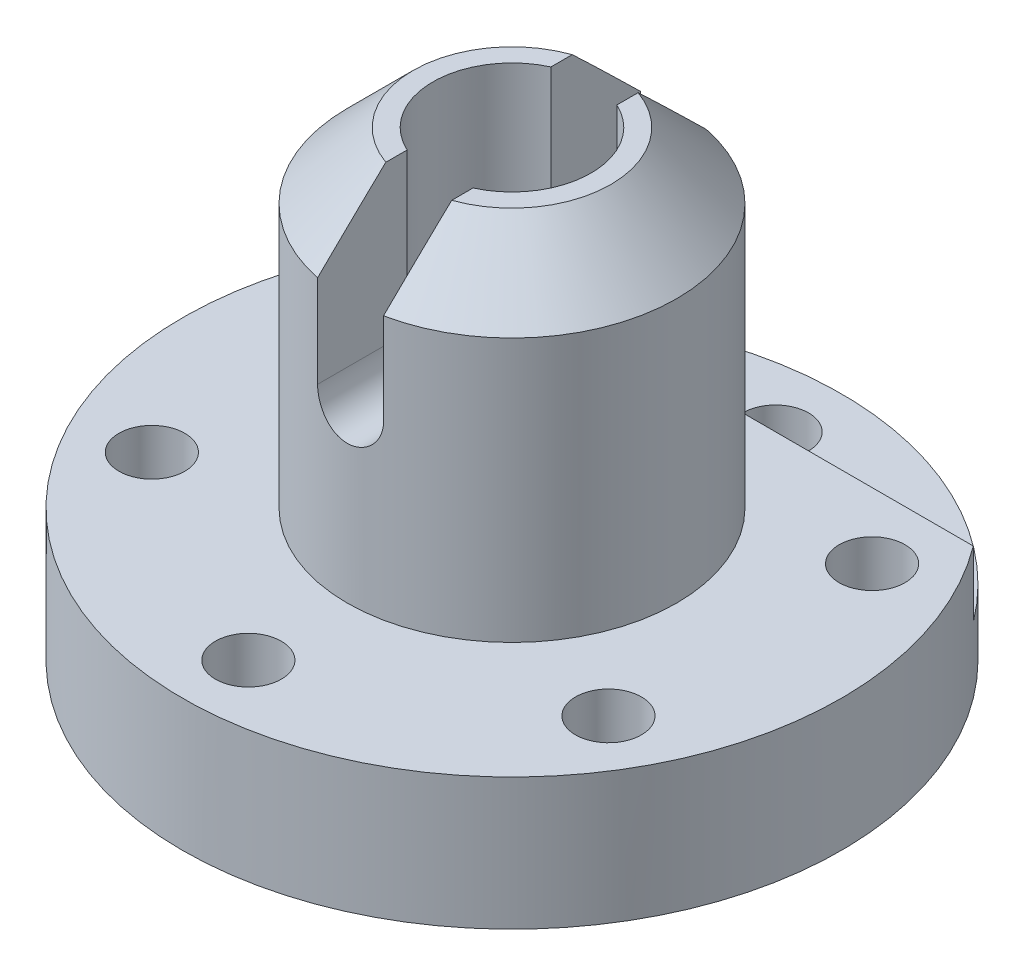
ISO-10303-21;
HEADER;
FILE_DESCRIPTION(('STEP AP214'),'2;1');
FILE_NAME('part.step','',(''),(''),'','','');
FILE_SCHEMA(('AUTOMOTIVE_DESIGN { 1 0 10303 214 1 1 1 1 }'));
ENDSEC;
DATA;
#1=APPLICATION_CONTEXT('core data for automotive mechanical design processes');
#2=APPLICATION_PROTOCOL_DEFINITION('international standard','automotive_design',2000,#1);
#3=PRODUCT_CONTEXT('',#1,'mechanical');
#4=PRODUCT('Part','Part','',(#3));
#5=PRODUCT_RELATED_PRODUCT_CATEGORY('part','',(#4));
#6=PRODUCT_DEFINITION_FORMATION('','',#4);
#7=PRODUCT_DEFINITION_CONTEXT('part definition',#1,'design');
#8=PRODUCT_DEFINITION('design','',#6,#7);
#9=PRODUCT_DEFINITION_SHAPE('','',#8);
#10=(LENGTH_UNIT() NAMED_UNIT(*) SI_UNIT(.MILLI.,.METRE.));
#11=(NAMED_UNIT(*) PLANE_ANGLE_UNIT() SI_UNIT($,.RADIAN.));
#12=(NAMED_UNIT(*) SI_UNIT($,.STERADIAN.) SOLID_ANGLE_UNIT());
#13=UNCERTAINTY_MEASURE_WITH_UNIT(LENGTH_MEASURE(1.E-05),#10,'distance_accuracy_value','');
#14=(GEOMETRIC_REPRESENTATION_CONTEXT(3) GLOBAL_UNCERTAINTY_ASSIGNED_CONTEXT((#13)) GLOBAL_UNIT_ASSIGNED_CONTEXT((#10,
#11,#12)) REPRESENTATION_CONTEXT('',''));
#15=CARTESIAN_POINT('',(0.,0.,0.));
#16=DIRECTION('',(0.,0.,1.));
#17=DIRECTION('',(1.,0.,0.));
#18=AXIS2_PLACEMENT_3D('',#15,#16,#17);
#19=CARTESIAN_POINT('',(0.,35.,0.));
#20=DIRECTION('',(0.,-1.,0.));
#21=DIRECTION('',(0.,0.,-1.));
#22=AXIS2_PLACEMENT_3D('',#19,#20,#21);
#23=CYLINDRICAL_SURFACE('',#22,6.);
#24=CARTESIAN_POINT('',(0.,10.,0.));
#25=DIRECTION('',(0.,1.,0.));
#26=DIRECTION('',(0.,0.,1.));
#27=AXIS2_PLACEMENT_3D('',#24,#25,#26);
#28=CIRCLE('',#27,6.);
#29=CARTESIAN_POINT('',(0.,10.,6.));
#30=VERTEX_POINT('',#29);
#31=EDGE_CURVE('E161',#30,#30,#28,.F.);
#32=ORIENTED_EDGE('',*,*,#31,.T.);
#33=EDGE_LOOP('',(#32));
#34=FACE_BOUND('',#33,.T.);
#35=CARTESIAN_POINT('',(0.,35.,0.));
#36=DIRECTION('',(0.,1.,0.));
#37=DIRECTION('',(0.,0.,1.));
#38=AXIS2_PLACEMENT_3D('',#35,#36,#37);
#39=CIRCLE('',#38,6.);
#40=CARTESIAN_POINT('',(-2.5,35.,-5.45435605731786));
#41=VERTEX_POINT('',#40);
#42=CARTESIAN_POINT('',(-2.5,35.,5.45435605731786));
#43=VERTEX_POINT('',#42);
#44=EDGE_CURVE('E151',#41,#43,#39,.T.);
#45=ORIENTED_EDGE('',*,*,#44,.T.);
#46=DIRECTION('',(0.,-1.,0.));
#47=VECTOR('',#46,1.);
#48=CARTESIAN_POINT('',(-2.5,35.,5.45435605731786));
#49=LINE('',#48,#47);
#50=CARTESIAN_POINT('',(-2.5,23.,5.45435605731786));
#51=VERTEX_POINT('',#50);
#52=EDGE_CURVE('E210',#43,#51,#49,.T.);
#53=ORIENTED_EDGE('',*,*,#52,.T.);
#54=CARTESIAN_POINT('',(2.5,23.,5.45435605731786));
#55=CARTESIAN_POINT('',(2.50001024965806,22.933009578603,5.4543414367274));
#56=CARTESIAN_POINT('',(2.49730766074456,22.8660271423929,5.45558986423115));
#57=CARTESIAN_POINT('',(2.48655699342007,22.732608782394,5.46050344433192));
#58=CARTESIAN_POINT('',(2.47851112553775,22.6661726441022,5.46416759753227));
#59=CARTESIAN_POINT('',(2.45719882557102,22.5345981401286,5.47378318611766));
#60=CARTESIAN_POINT('',(2.44395446621823,22.4694554951153,5.47972494833872));
#61=CARTESIAN_POINT('',(2.41239773056354,22.3406523494294,5.49369035165668));
#62=CARTESIAN_POINT('',(2.39408500729503,22.2769919505508,5.50171413528084));
#63=CARTESIAN_POINT('',(2.33184505253746,22.0890295233108,5.52852216859036));
#64=CARTESIAN_POINT('',(2.28056973965757,21.9674650590801,5.55006534458072));
#65=CARTESIAN_POINT('',(2.16009667726577,21.734605030022,5.5980502687434));
#66=CARTESIAN_POINT('',(2.09088024017803,21.6233203375838,5.62449711638194));
#67=CARTESIAN_POINT('',(1.93194216605247,21.4073444819703,5.68111739532849));
#68=CARTESIAN_POINT('',(1.84129131772597,21.3033685362415,5.71141645652258));
#69=CARTESIAN_POINT('',(1.64402473251641,21.1115830630309,5.77129106659512));
#70=CARTESIAN_POINT('',(1.53740558511416,21.0237769980765,5.80086645933831));
#71=CARTESIAN_POINT('',(1.3055266241911,20.8631011710238,5.85751079611205));
#72=CARTESIAN_POINT('',(1.17965801419142,20.7910465122975,5.88441492036276));
#73=CARTESIAN_POINT('',(0.916263349803656,20.6694476051954,5.93113050419023));
#74=CARTESIAN_POINT('',(0.778742558960749,20.6198932565872,5.95094514533806));
#75=CARTESIAN_POINT('',(0.503538212911764,20.5473214289529,5.98035028996095));
#76=CARTESIAN_POINT('',(0.366235636683351,20.5230570539867,5.99041924152298));
#77=CARTESIAN_POINT('',(0.0891608856613075,20.497724732109,6.00093656296527));
#78=CARTESIAN_POINT('',(-0.0506103107853695,20.4966477933812,6.00138866214753));
#79=CARTESIAN_POINT('',(-0.319586702683724,20.5170686483622,5.99290254661358));
#80=CARTESIAN_POINT('',(-0.448917245472144,20.5371965487351,5.98453414521297));
#81=CARTESIAN_POINT('',(-0.702167963543971,20.5971069089122,5.96013005449445));
#82=CARTESIAN_POINT('',(-0.826087834150438,20.6368904739846,5.94409393401056));
#83=CARTESIAN_POINT('',(-1.06727556823007,20.7354557836619,5.90559715444489));
#84=CARTESIAN_POINT('',(-1.1844130633202,20.7945181793044,5.88304219015531));
#85=CARTESIAN_POINT('',(-1.40742238732224,20.9296907819691,5.83371457161593));
#86=CARTESIAN_POINT('',(-1.51329009151026,21.0058071993045,5.80694038196897));
#87=CARTESIAN_POINT('',(-1.71867537807254,21.1791590335425,5.74963576527152));
#88=CARTESIAN_POINT('',(-1.81722082953265,21.2775041712583,5.71897359653013));
#89=CARTESIAN_POINT('',(-1.99685313522822,21.4894106464249,5.65876079183101));
#90=CARTESIAN_POINT('',(-2.07793113494236,21.6029796539946,5.62921072584973));
#91=CARTESIAN_POINT('',(-2.22284514508404,21.8468546501545,5.57361619012468));
#92=CARTESIAN_POINT('',(-2.28601504206341,21.9775928734739,5.54772171984214));
#93=CARTESIAN_POINT('',(-2.38897619183128,22.2491453734569,5.50417661447929));
#94=CARTESIAN_POINT('',(-2.4288105117282,22.3899405469978,5.48651080537515));
#95=CARTESIAN_POINT('',(-2.47065526537902,22.6101508434078,5.46773287951056));
#96=CARTESIAN_POINT('',(-2.48164099212926,22.6876310667866,5.46274303006064));
#97=CARTESIAN_POINT('',(-2.49631631258703,22.8433901813396,5.45604541462647));
#98=CARTESIAN_POINT('',(-2.50000851178051,22.9216687772607,5.45433647659977));
#99=CARTESIAN_POINT('',(-2.5,23.,5.45435605731786));
#100=B_SPLINE_CURVE_WITH_KNOTS('',3,(#54,#55,#56,#57,#58,#59,#60,#61,#62,#63,#64,#65,#66,#67,
#68,#69,#70,#71,#72,#73,#74,#75,#76,#77,#78,#79,#80,#81,#82,#83,#84,#85,#86,#87,#88,#89,#90,#91,
#92,#93,#94,#95,#96,#97,#98,#99),.UNSPECIFIED.,.F.,.F.,(4,2,2,2,2,2,2,2,2,2,2,2,2,2,2,2,2,2,2,2,
2,2,4),(0.,0.200891876435008,0.401700695097973,0.601665948391959,0.801644894158599,
1.20075599352942,1.6002844916061,2.02212344548655,2.44405262481498,2.88432120276328,
3.32439195134774,3.74155898035476,4.15856423395471,4.55019084443641,4.94183947919071,
5.33946474085078,5.73723503589979,6.16301556467704,6.58901142297275,7.02923147484728,
7.4686364954648,7.70350874445825,7.93829707423866),.UNSPECIFIED.);
#101=CARTESIAN_POINT('',(2.5,23.,5.45435605731786));
#102=VERTEX_POINT('',#101);
#103=EDGE_CURVE('E143',#102,#51,#100,.T.);
#104=ORIENTED_EDGE('',*,*,#103,.F.);
#105=DIRECTION('',(0.,-1.,0.));
#106=VECTOR('',#105,1.);
#107=CARTESIAN_POINT('',(2.5,35.,5.45435605731786));
#108=LINE('',#107,#106);
#109=CARTESIAN_POINT('',(2.5,35.,5.45435605731786));
#110=VERTEX_POINT('',#109);
#111=EDGE_CURVE('E129',#110,#102,#108,.T.);
#112=ORIENTED_EDGE('',*,*,#111,.F.);
#113=CARTESIAN_POINT('',(2.5,35.,-5.45435605731786));
#114=VERTEX_POINT('',#113);
#115=EDGE_CURVE('E141',#110,#114,#39,.T.);
#116=ORIENTED_EDGE('',*,*,#115,.T.);
#117=DIRECTION('',(0.,-1.,0.));
#118=VECTOR('',#117,1.);
#119=CARTESIAN_POINT('',(2.5,35.,-5.45435605731786));
#120=LINE('',#119,#118);
#121=CARTESIAN_POINT('',(2.5,23.,-5.45435605731786));
#122=VERTEX_POINT('',#121);
#123=EDGE_CURVE('E145',#122,#114,#120,.F.);
#124=ORIENTED_EDGE('',*,*,#123,.F.);
#125=CARTESIAN_POINT('',(-2.5,23.,-5.45435605731786));
#126=CARTESIAN_POINT('',(-2.50001024965805,22.933009578603,-5.4543414367274));
#127=CARTESIAN_POINT('',(-2.49730766074456,22.8660271423929,-5.45558986423115));
#128=CARTESIAN_POINT('',(-2.48655699342007,22.732608782394,-5.46050344433192));
#129=CARTESIAN_POINT('',(-2.47851112553775,22.6661726441022,-5.46416759753227));
#130=CARTESIAN_POINT('',(-2.45719882557102,22.5345981401286,-5.47378318611766));
#131=CARTESIAN_POINT('',(-2.44395446621823,22.4694554951153,-5.47972494833872));
#132=CARTESIAN_POINT('',(-2.41239773056354,22.3406523494294,-5.49369035165668));
#133=CARTESIAN_POINT('',(-2.39408500729503,22.2769919505508,-5.50171413528084));
#134=CARTESIAN_POINT('',(-2.33184505253746,22.0890295233108,-5.52852216859036));
#135=CARTESIAN_POINT('',(-2.28056973965756,21.9674650590801,-5.55006534458073));
#136=CARTESIAN_POINT('',(-2.16009667726576,21.734605030022,-5.5980502687434));
#137=CARTESIAN_POINT('',(-2.09088024017802,21.6233203375838,-5.62449711638194));
#138=CARTESIAN_POINT('',(-1.93194216605246,21.4073444819703,-5.6811173953285));
#139=CARTESIAN_POINT('',(-1.84129131772596,21.3033685362415,-5.71141645652258));
#140=CARTESIAN_POINT('',(-1.6440247325164,21.1115830630309,-5.77129106659512));
#141=CARTESIAN_POINT('',(-1.53740558511415,21.0237769980765,-5.80086645933832));
#142=CARTESIAN_POINT('',(-1.30552662419109,20.8631011710238,-5.85751079611205));
#143=CARTESIAN_POINT('',(-1.17965801419141,20.7910465122975,-5.88441492036276));
#144=CARTESIAN_POINT('',(-0.916263349803652,20.6694476051954,-5.93113050419023));
#145=CARTESIAN_POINT('',(-0.778742558960745,20.6198932565872,-5.95094514533806));
#146=CARTESIAN_POINT('',(-0.50353821291176,20.5473214289529,-5.98035028996095));
#147=CARTESIAN_POINT('',(-0.366235636683347,20.5230570539867,-5.99041924152298));
#148=CARTESIAN_POINT('',(-0.0891608856613033,20.497724732109,-6.00093656296527));
#149=CARTESIAN_POINT('',(0.0506103107853738,20.4966477933812,-6.00138866214753));
#150=CARTESIAN_POINT('',(0.319586702683728,20.5170686483622,-5.99290254661358));
#151=CARTESIAN_POINT('',(0.448917245472148,20.5371965487351,-5.98453414521297));
#152=CARTESIAN_POINT('',(0.702167963543975,20.5971069089122,-5.96013005449445));
#153=CARTESIAN_POINT('',(0.826087834150443,20.6368904739846,-5.94409393401056));
#154=CARTESIAN_POINT('',(1.06727556823007,20.7354557836619,-5.90559715444489));
#155=CARTESIAN_POINT('',(1.18441306332021,20.7945181793044,-5.88304219015531));
#156=CARTESIAN_POINT('',(1.40742238732224,20.9296907819691,-5.83371457161593));
#157=CARTESIAN_POINT('',(1.51329009151026,21.0058071993045,-5.80694038196897));
#158=CARTESIAN_POINT('',(1.71867537807254,21.1791590335425,-5.74963576527152));
#159=CARTESIAN_POINT('',(1.81722082953265,21.2775041712583,-5.71897359653013));
#160=CARTESIAN_POINT('',(1.99685313522822,21.4894106464249,-5.65876079183101));
#161=CARTESIAN_POINT('',(2.07793113494236,21.6029796539946,-5.62921072584973));
#162=CARTESIAN_POINT('',(2.22284514508405,21.8468546501545,-5.57361619012468));
#163=CARTESIAN_POINT('',(2.28601504206341,21.9775928734739,-5.54772171984214));
#164=CARTESIAN_POINT('',(2.38897619183128,22.2491453734569,-5.50417661447929));
#165=CARTESIAN_POINT('',(2.42881051172821,22.3899405469978,-5.48651080537515));
#166=CARTESIAN_POINT('',(2.47065526537903,22.6101508434078,-5.46773287951056));
#167=CARTESIAN_POINT('',(2.48164099212927,22.6876310667866,-5.46274303006064));
#168=CARTESIAN_POINT('',(2.49631631258704,22.8433901813396,-5.45604541462647));
#169=CARTESIAN_POINT('',(2.50000851178052,22.9216687772607,-5.45433647659977));
#170=CARTESIAN_POINT('',(2.5,23.,-5.45435605731786));
#171=B_SPLINE_CURVE_WITH_KNOTS('',3,(#125,#126,#127,#128,#129,#130,#131,#132,#133,#134,#135,
#136,#137,#138,#139,#140,#141,#142,#143,#144,#145,#146,#147,#148,#149,#150,#151,#152,#153,#154,
#155,#156,#157,#158,#159,#160,#161,#162,#163,#164,#165,#166,#167,#168,#169,#170),.UNSPECIFIED.,
.F.,.F.,(4,2,2,2,2,2,2,2,2,2,2,2,2,2,2,2,2,2,2,2,2,2,4),(0.,0.200891876435008,0.401700695097969,
0.601665948391959,0.801644894158599,1.20075599352942,1.6002844916061,2.02212344548655,
2.44405262481498,2.88432120276328,3.32439195134774,3.74155898035476,4.15856423395471,
4.55019084443641,4.94183947919071,5.33946474085078,5.73723503589979,6.16301556467703,
6.58901142297275,7.02923147484728,7.4686364954648,7.70350874445825,7.93829707423866),.UNSPECIFIED.);
#172=CARTESIAN_POINT('',(-2.5,23.,-5.45435605731786));
#173=VERTEX_POINT('',#172);
#174=EDGE_CURVE('E205',#173,#122,#171,.T.);
#175=ORIENTED_EDGE('',*,*,#174,.F.);
#176=DIRECTION('',(0.,-1.,0.));
#177=VECTOR('',#176,1.);
#178=CARTESIAN_POINT('',(-2.5,35.,-5.45435605731786));
#179=LINE('',#178,#177);
#180=EDGE_CURVE('E341',#173,#41,#179,.F.);
#181=ORIENTED_EDGE('',*,*,#180,.T.);
#182=EDGE_LOOP('',(#45,#53,#104,#112,#116,#124,#175,#181));
#183=FACE_BOUND('',#182,.T.);
#184=ADVANCED_FACE('F35',(#34,#183),#23,.F.);
#185=CARTESIAN_POINT('',(0.,35.,0.));
#186=DIRECTION('',(0.,-1.,0.));
#187=DIRECTION('',(0.,0.,-1.));
#188=AXIS2_PLACEMENT_3D('',#185,#186,#187);
#189=CYLINDRICAL_SURFACE('',#188,12.5);
#190=CARTESIAN_POINT('',(0.,10.,0.));
#191=DIRECTION('',(0.,1.,0.));
#192=DIRECTION('',(0.,0.,1.));
#193=AXIS2_PLACEMENT_3D('',#190,#191,#192);
#194=CIRCLE('',#193,12.5);
#195=CARTESIAN_POINT('',(0.,10.,12.5));
#196=VERTEX_POINT('',#195);
#197=EDGE_CURVE('E150',#196,#196,#194,.F.);
#198=ORIENTED_EDGE('',*,*,#197,.F.);
#199=EDGE_LOOP('',(#198));
#200=FACE_BOUND('',#199,.T.);
#201=DIRECTION('',(0.,-1.,0.));
#202=VECTOR('',#201,1.);
#203=CARTESIAN_POINT('',(-2.5,35.,12.2474487139159));
#204=LINE('',#203,#202);
#205=CARTESIAN_POINT('',(-2.5,30.,12.2474487139159));
#206=VERTEX_POINT('',#205);
#207=CARTESIAN_POINT('',(-2.5,23.,12.2474487139159));
#208=VERTEX_POINT('',#207);
#209=EDGE_CURVE('E340',#206,#208,#204,.T.);
#210=ORIENTED_EDGE('',*,*,#209,.F.);
#211=CARTESIAN_POINT('',(0.,30.,0.));
#212=DIRECTION('',(0.,1.,0.));
#213=DIRECTION('',(0.,0.,1.));
#214=AXIS2_PLACEMENT_3D('',#211,#212,#213);
#215=CIRCLE('',#214,12.5);
#216=CARTESIAN_POINT('',(-2.5,30.,-12.2474487139159));
#217=VERTEX_POINT('',#216);
#218=EDGE_CURVE('E255',#206,#217,#215,.F.);
#219=ORIENTED_EDGE('',*,*,#218,.T.);
#220=DIRECTION('',(0.,-1.,0.));
#221=VECTOR('',#220,1.);
#222=CARTESIAN_POINT('',(-2.5,35.,-12.2474487139159));
#223=LINE('',#222,#221);
#224=CARTESIAN_POINT('',(-2.5,23.,-12.2474487139159));
#225=VERTEX_POINT('',#224);
#226=EDGE_CURVE('E144',#225,#217,#223,.F.);
#227=ORIENTED_EDGE('',*,*,#226,.F.);
#228=CARTESIAN_POINT('',(-2.5,23.,-12.2474487139159));
#229=CARTESIAN_POINT('',(-2.50000755272741,22.9304359928512,-12.2474426870481));
#230=CARTESIAN_POINT('',(-2.49709659553059,22.8608761581153,-12.2480412546813));
#231=CARTESIAN_POINT('',(-2.48549624534853,22.7222682500258,-12.2504029528616));
#232=CARTESIAN_POINT('',(-2.47680756718742,22.6532201144329,-12.2521659393457));
#233=CARTESIAN_POINT('',(-2.45372788482214,22.5162257533478,-12.25680833904));
#234=CARTESIAN_POINT('',(-2.43934556755122,22.4482780125864,-12.259686051341));
#235=CARTESIAN_POINT('',(-2.40500601307056,22.3138779894138,-12.2664685140533));
#236=CARTESIAN_POINT('',(-2.38504875310239,22.2474257131086,-12.2703732686573));
#237=CARTESIAN_POINT('',(-2.31701273293409,22.0509952453209,-12.2834692504436));
#238=CARTESIAN_POINT('',(-2.26075131705718,21.9238349517029,-12.2940461363477));
#239=CARTESIAN_POINT('',(-2.12812970933265,21.6808105143781,-12.3176934066007));
#240=CARTESIAN_POINT('',(-2.0517674343692,21.5649475431551,-12.3307640493469));
#241=CARTESIAN_POINT('',(-1.87995278838546,21.3461078517031,-12.3581317705241));
#242=CARTESIAN_POINT('',(-1.78427266064757,21.2433112895975,-12.3724421926957));
#243=CARTESIAN_POINT('',(-1.57702607132326,21.0551119063013,-12.4005606698654));
#244=CARTESIAN_POINT('',(-1.46545715284151,20.9697117801072,-12.4143686467546));
#245=CARTESIAN_POINT('',(-1.2284002437141,20.8180282891781,-12.4400702526805));
#246=CARTESIAN_POINT('',(-1.10279959145392,20.751917721986,-12.4519461799055));
#247=CARTESIAN_POINT('',(-0.842002975760172,20.6418101436303,-12.4722938885068));
#248=CARTESIAN_POINT('',(-0.706808435013477,20.5978098614993,-12.4807661733763));
#249=CARTESIAN_POINT('',(-0.432543529973127,20.5337324169305,-12.4932579438613));
#250=CARTESIAN_POINT('',(-0.293547588516974,20.5133480364947,-12.4973345628875));
#251=CARTESIAN_POINT('',(-0.0140496897959911,20.4961225412003,-12.5007730438039));
#252=CARTESIAN_POINT('',(0.126452156532599,20.499279703838,-12.5001352506414));
#253=CARTESIAN_POINT('',(0.402855506346824,20.5288155036062,-12.494260861056));
#254=CARTESIAN_POINT('',(0.538794033247037,20.5548626254794,-12.4890899207821));
#255=CARTESIAN_POINT('',(0.804330016531261,20.6289129417226,-12.4748043625546));
#256=CARTESIAN_POINT('',(0.933927265392436,20.6769168541128,-12.4656896156329));
#257=CARTESIAN_POINT('',(1.18405067824291,20.7938260089324,-12.4444322280103));
#258=CARTESIAN_POINT('',(1.3045143170306,20.8628614673669,-12.4322708097766));
#259=CARTESIAN_POINT('',(1.53226609471825,21.0197756756397,-12.4062612907301));
#260=CARTESIAN_POINT('',(1.63955314055332,21.1076559870953,-12.3924130501763));
#261=CARTESIAN_POINT('',(1.83986551634353,21.3015709040774,-12.3642759342124));
#262=CARTESIAN_POINT('',(1.93261173748933,21.4078935051827,-12.3499835810434));
#263=CARTESIAN_POINT('',(2.0990272497494,21.6347618962184,-12.3227926529107));
#264=CARTESIAN_POINT('',(2.17269125605404,21.7553116129146,-12.3098944646352));
#265=CARTESIAN_POINT('',(2.29894988661171,22.0076310123658,-12.286943251058));
#266=CARTESIAN_POINT('',(2.3514871915862,22.1394300584917,-12.2768979874586));
#267=CARTESIAN_POINT('',(2.43351774332483,22.4101465781389,-12.2609040265623));
#268=CARTESIAN_POINT('',(2.46304531871083,22.5490531166203,-12.2549492282072));
#269=CARTESIAN_POINT('',(2.48708234530492,22.7408920421161,-12.2500794297991));
#270=CARTESIAN_POINT('',(2.49192813913878,22.7926353494561,-12.2490939967998));
#271=CARTESIAN_POINT('',(2.49838291166163,22.8962446603436,-12.2477791846693));
#272=CARTESIAN_POINT('',(2.49999730726164,22.9481103123895,-12.2474487076206));
#273=CARTESIAN_POINT('',(2.5,23.,-12.2474487139159));
#274=B_SPLINE_CURVE_WITH_KNOTS('',3,(#228,#229,#230,#231,#232,#233,#234,#235,#236,#237,#238,
#239,#240,#241,#242,#243,#244,#245,#246,#247,#248,#249,#250,#251,#252,#253,#254,#255,#256,#257,
#258,#259,#260,#261,#262,#263,#264,#265,#266,#267,#268,#269,#270,#271,#272,#273),.UNSPECIFIED.,
.F.,.F.,(4,2,2,2,2,2,2,2,2,2,2,2,2,2,2,2,2,2,2,2,2,2,4),(0.,0.208621275894803,0.417216745803839,
0.62549517523698,0.833774454931106,1.25000691135225,1.66628252025787,2.08778731527756,
2.50935735880446,2.93459542557449,3.35977056463055,3.77935021287091,4.19889916132035,
4.61247011057754,5.02605458519858,5.44225366753897,5.85848725240716,6.28192795775072,
6.70548580970531,7.13018519486866,7.55424974394838,7.71010621722896,7.86570120305829),.UNSPECIFIED.);
#275=CARTESIAN_POINT('',(2.5,23.,-12.2474487139159));
#276=VERTEX_POINT('',#275);
#277=EDGE_CURVE('E172',#225,#276,#274,.T.);
#278=ORIENTED_EDGE('',*,*,#277,.T.);
#279=DIRECTION('',(0.,-1.,0.));
#280=VECTOR('',#279,1.);
#281=CARTESIAN_POINT('',(2.5,35.,-12.2474487139159));
#282=LINE('',#281,#280);
#283=CARTESIAN_POINT('',(2.5,30.,-12.2474487139159));
#284=VERTEX_POINT('',#283);
#285=EDGE_CURVE('E332',#276,#284,#282,.F.);
#286=ORIENTED_EDGE('',*,*,#285,.T.);
#287=CARTESIAN_POINT('',(0.,30.,0.));
#288=DIRECTION('',(0.,1.,0.));
#289=DIRECTION('',(0.,0.,1.));
#290=AXIS2_PLACEMENT_3D('',#287,#288,#289);
#291=CIRCLE('',#290,12.5);
#292=CARTESIAN_POINT('',(2.5,30.,12.2474487139159));
#293=VERTEX_POINT('',#292);
#294=EDGE_CURVE('E357',#284,#293,#291,.F.);
#295=ORIENTED_EDGE('',*,*,#294,.T.);
#296=DIRECTION('',(0.,-1.,0.));
#297=VECTOR('',#296,1.);
#298=CARTESIAN_POINT('',(2.5,35.,12.2474487139159));
#299=LINE('',#298,#297);
#300=CARTESIAN_POINT('',(2.5,23.,12.2474487139159));
#301=VERTEX_POINT('',#300);
#302=EDGE_CURVE('E335',#293,#301,#299,.T.);
#303=ORIENTED_EDGE('',*,*,#302,.T.);
#304=CARTESIAN_POINT('',(2.5,23.,12.2474487139159));
#305=CARTESIAN_POINT('',(2.50000755272741,22.9304359928512,12.2474426870481));
#306=CARTESIAN_POINT('',(2.4970965955306,22.8608761581153,12.2480412546813));
#307=CARTESIAN_POINT('',(2.48549624534853,22.7222682500258,12.2504029528616));
#308=CARTESIAN_POINT('',(2.47680756718743,22.6532201144329,12.2521659393457));
#309=CARTESIAN_POINT('',(2.45372788482215,22.5162257533478,12.25680833904));
#310=CARTESIAN_POINT('',(2.43934556755123,22.4482780125864,12.259686051341));
#311=CARTESIAN_POINT('',(2.40500601307056,22.3138779894138,12.2664685140532));
#312=CARTESIAN_POINT('',(2.38504875310239,22.2474257131086,12.2703732686573));
#313=CARTESIAN_POINT('',(2.31701273293409,22.0509952453209,12.2834692504436));
#314=CARTESIAN_POINT('',(2.26075131705718,21.9238349517029,12.2940461363477));
#315=CARTESIAN_POINT('',(2.12812970933265,21.6808105143781,12.3176934066007));
#316=CARTESIAN_POINT('',(2.0517674343692,21.5649475431551,12.3307640493469));
#317=CARTESIAN_POINT('',(1.87995278838546,21.3461078517031,12.3581317705241));
#318=CARTESIAN_POINT('',(1.78427266064757,21.2433112895975,12.3724421926957));
#319=CARTESIAN_POINT('',(1.57702607132326,21.0551119063013,12.4005606698654));
#320=CARTESIAN_POINT('',(1.46545715284151,20.9697117801072,12.4143686467546));
#321=CARTESIAN_POINT('',(1.2284002437141,20.8180282891781,12.4400702526805));
#322=CARTESIAN_POINT('',(1.10279959145392,20.751917721986,12.4519461799055));
#323=CARTESIAN_POINT('',(0.842002975760175,20.6418101436303,12.4722938885068));
#324=CARTESIAN_POINT('',(0.70680843501348,20.5978098614993,12.4807661733763));
#325=CARTESIAN_POINT('',(0.432543529973132,20.5337324169305,12.4932579438613));
#326=CARTESIAN_POINT('',(0.293547588516979,20.5133480364947,12.4973345628875));
#327=CARTESIAN_POINT('',(0.0140496897959951,20.4961225412003,12.5007730438039));
#328=CARTESIAN_POINT('',(-0.126452156532594,20.499279703838,12.5001352506414));
#329=CARTESIAN_POINT('',(-0.40285550634682,20.5288155036062,12.494260861056));
#330=CARTESIAN_POINT('',(-0.538794033247033,20.5548626254794,12.4890899207821));
#331=CARTESIAN_POINT('',(-0.804330016531256,20.6289129417226,12.4748043625546));
#332=CARTESIAN_POINT('',(-0.933927265392432,20.6769168541128,12.4656896156329));
#333=CARTESIAN_POINT('',(-1.1840506782429,20.7938260089324,12.4444322280103));
#334=CARTESIAN_POINT('',(-1.30451431703059,20.8628614673669,12.4322708097766));
#335=CARTESIAN_POINT('',(-1.53226609471824,21.0197756756397,12.4062612907301));
#336=CARTESIAN_POINT('',(-1.63955314055331,21.1076559870953,12.3924130501763));
#337=CARTESIAN_POINT('',(-1.83986551634353,21.3015709040774,12.3642759342124));
#338=CARTESIAN_POINT('',(-1.93261173748932,21.4078935051827,12.3499835810434));
#339=CARTESIAN_POINT('',(-2.0990272497494,21.6347618962184,12.3227926529107));
#340=CARTESIAN_POINT('',(-2.17269125605403,21.7553116129146,12.3098944646352));
#341=CARTESIAN_POINT('',(-2.29894988661171,22.0076310123658,12.286943251058));
#342=CARTESIAN_POINT('',(-2.3514871915862,22.1394300584917,12.2768979874586));
#343=CARTESIAN_POINT('',(-2.43351774332483,22.410146578139,12.2609040265623));
#344=CARTESIAN_POINT('',(-2.46304531871083,22.5490531166203,12.2549492282072));
#345=CARTESIAN_POINT('',(-2.48708234530491,22.7408920421161,12.2500794297991));
#346=CARTESIAN_POINT('',(-2.49192813913877,22.7926353494561,12.2490939967998));
#347=CARTESIAN_POINT('',(-2.49838291166163,22.8962446603436,12.2477791846693));
#348=CARTESIAN_POINT('',(-2.49999730726164,22.9481103123895,12.2474487076206));
#349=CARTESIAN_POINT('',(-2.5,23.,12.2474487139159));
#350=B_SPLINE_CURVE_WITH_KNOTS('',3,(#304,#305,#306,#307,#308,#309,#310,#311,#312,#313,#314,
#315,#316,#317,#318,#319,#320,#321,#322,#323,#324,#325,#326,#327,#328,#329,#330,#331,#332,#333,
#334,#335,#336,#337,#338,#339,#340,#341,#342,#343,#344,#345,#346,#347,#348,#349),.UNSPECIFIED.,
.F.,.F.,(4,2,2,2,2,2,2,2,2,2,2,2,2,2,2,2,2,2,2,2,2,2,4),(0.,0.208621275894803,0.417216745803839,
0.62549517523698,0.833774454931106,1.25000691135225,1.66628252025787,2.08778731527756,
2.50935735880446,2.93459542557449,3.35977056463055,3.77935021287091,4.19889916132035,
4.61247011057754,5.02605458519858,5.44225366753897,5.85848725240716,6.28192795775072,
6.70548580970531,7.13018519486867,7.55424974394838,7.71010621722896,7.86570120305829),.UNSPECIFIED.);
#351=EDGE_CURVE('E180',#301,#208,#350,.T.);
#352=ORIENTED_EDGE('',*,*,#351,.T.);
#353=EDGE_LOOP('',(#210,#219,#227,#278,#286,#295,#303,#352));
#354=FACE_BOUND('',#353,.T.);
#355=ADVANCED_FACE('F185',(#200,#354),#189,.T.);
#356=CARTESIAN_POINT('',(0.,35.,0.));
#357=DIRECTION('',(0.,1.,0.));
#358=DIRECTION('',(0.,0.,1.));
#359=AXIS2_PLACEMENT_3D('',#356,#357,#358);
#360=PLANE('',#359);
#361=DIRECTION('',(0.,0.,-1.));
#362=VECTOR('',#361,1.);
#363=CARTESIAN_POINT('',(-2.5,35.,0.));
#364=LINE('',#363,#362);
#365=CARTESIAN_POINT('',(-2.5,35.,-7.07106781186548));
#366=VERTEX_POINT('',#365);
#367=EDGE_CURVE('E133',#41,#366,#364,.T.);
#368=ORIENTED_EDGE('',*,*,#367,.T.);
#369=CARTESIAN_POINT('',(0.,35.,0.));
#370=DIRECTION('',(0.,1.,0.));
#371=DIRECTION('',(0.,0.,1.));
#372=AXIS2_PLACEMENT_3D('',#369,#370,#371);
#373=CIRCLE('',#372,7.5);
#374=CARTESIAN_POINT('',(-2.5,35.,7.07106781186548));
#375=VERTEX_POINT('',#374);
#376=EDGE_CURVE('E353',#366,#375,#373,.T.);
#377=ORIENTED_EDGE('',*,*,#376,.T.);
#378=EDGE_CURVE('E171',#375,#43,#364,.T.);
#379=ORIENTED_EDGE('',*,*,#378,.T.);
#380=ORIENTED_EDGE('',*,*,#44,.F.);
#381=EDGE_LOOP('',(#368,#377,#379,#380));
#382=FACE_BOUND('',#381,.T.);
#383=ADVANCED_FACE('F232',(#382),#360,.T.);
#384=CARTESIAN_POINT('',(0.,10.,0.));
#385=DIRECTION('',(0.,-1.,0.));
#386=DIRECTION('',(0.,0.,-1.));
#387=AXIS2_PLACEMENT_3D('',#384,#385,#386);
#388=CYLINDRICAL_SURFACE('',#387,25.);
#389=CARTESIAN_POINT('',(0.,0.,0.));
#390=DIRECTION('',(0.,1.,0.));
#391=DIRECTION('',(0.,0.,1.));
#392=AXIS2_PLACEMENT_3D('',#389,#390,#391);
#393=CIRCLE('',#392,25.);
#394=CARTESIAN_POINT('',(0.,0.,25.));
#395=VERTEX_POINT('',#394);
#396=EDGE_CURVE('E154',#395,#395,#393,.T.);
#397=ORIENTED_EDGE('',*,*,#396,.T.);
#398=EDGE_LOOP('',(#397));
#399=FACE_BOUND('',#398,.T.);
#400=DIRECTION('',(0.,-1.,0.));
#401=VECTOR('',#400,1.);
#402=CARTESIAN_POINT('',(20.,51.2310562561766,-15.));
#403=LINE('',#402,#401);
#404=CARTESIAN_POINT('',(20.,10.,-15.));
#405=VERTEX_POINT('',#404);
#406=CARTESIAN_POINT('',(20.,5.,-15.));
#407=VERTEX_POINT('',#406);
#408=EDGE_CURVE('E371',#405,#407,#403,.T.);
#409=ORIENTED_EDGE('',*,*,#408,.F.);
#410=CARTESIAN_POINT('',(0.,10.,0.));
#411=DIRECTION('',(0.,1.,0.));
#412=DIRECTION('',(0.,0.,1.));
#413=AXIS2_PLACEMENT_3D('',#410,#411,#412);
#414=CIRCLE('',#413,25.);
#415=CARTESIAN_POINT('',(-20.,10.,-15.));
#416=VERTEX_POINT('',#415);
#417=EDGE_CURVE('E164',#416,#405,#414,.T.);
#418=ORIENTED_EDGE('',*,*,#417,.F.);
#419=DIRECTION('',(0.,-1.,0.));
#420=VECTOR('',#419,1.);
#421=CARTESIAN_POINT('',(-20.,51.2310562561766,-15.));
#422=LINE('',#421,#420);
#423=CARTESIAN_POINT('',(-20.,5.,-15.));
#424=VERTEX_POINT('',#423);
#425=EDGE_CURVE('E158',#416,#424,#422,.T.);
#426=ORIENTED_EDGE('',*,*,#425,.T.);
#427=CARTESIAN_POINT('',(0.,5.,0.));
#428=DIRECTION('',(0.,1.,0.));
#429=DIRECTION('',(0.,0.,1.));
#430=AXIS2_PLACEMENT_3D('',#427,#428,#429);
#431=CIRCLE('',#430,25.);
#432=EDGE_CURVE('E373',#407,#424,#431,.T.);
#433=ORIENTED_EDGE('',*,*,#432,.F.);
#434=EDGE_LOOP('',(#409,#418,#426,#433));
#435=FACE_BOUND('',#434,.T.);
#436=ADVANCED_FACE('F225',(#399,#435),#388,.T.);
#437=CARTESIAN_POINT('',(0.,10.,0.));
#438=DIRECTION('',(0.,1.,0.));
#439=DIRECTION('',(0.,0.,1.));
#440=AXIS2_PLACEMENT_3D('',#437,#438,#439);
#441=PLANE('',#440);
#442=CARTESIAN_POINT('',(17.3205080756887,10.,-10.0000000000002));
#443=DIRECTION('',(0.,1.,0.));
#444=DIRECTION('',(0.,0.,1.));
#445=AXIS2_PLACEMENT_3D('',#442,#443,#444);
#446=CIRCLE('',#445,2.5);
#447=CARTESIAN_POINT('',(17.3205080756887,10.,-7.5000000000002));
#448=VERTEX_POINT('',#447);
#449=EDGE_CURVE('E318',#448,#448,#446,.F.);
#450=ORIENTED_EDGE('',*,*,#449,.T.);
#451=EDGE_LOOP('',(#450));
#452=FACE_BOUND('',#451,.T.);
#453=CARTESIAN_POINT('',(17.3205080756889,10.,9.99999999999984));
#454=DIRECTION('',(0.,1.,0.));
#455=DIRECTION('',(0.,0.,1.));
#456=AXIS2_PLACEMENT_3D('',#453,#454,#455);
#457=CIRCLE('',#456,2.5);
#458=CARTESIAN_POINT('',(17.3205080756889,10.,12.4999999999998));
#459=VERTEX_POINT('',#458);
#460=EDGE_CURVE('E315',#459,#459,#457,.F.);
#461=ORIENTED_EDGE('',*,*,#460,.T.);
#462=EDGE_LOOP('',(#461));
#463=FACE_BOUND('',#462,.T.);
#464=CARTESIAN_POINT('',(0.,10.,20.));
#465=DIRECTION('',(0.,1.,0.));
#466=DIRECTION('',(0.,0.,1.));
#467=AXIS2_PLACEMENT_3D('',#464,#465,#466);
#468=CIRCLE('',#467,2.5);
#469=CARTESIAN_POINT('',(0.,10.,22.5));
#470=VERTEX_POINT('',#469);
#471=EDGE_CURVE('E312',#470,#470,#468,.F.);
#472=ORIENTED_EDGE('',*,*,#471,.T.);
#473=EDGE_LOOP('',(#472));
#474=FACE_BOUND('',#473,.T.);
#475=CARTESIAN_POINT('',(-17.3205080756887,10.,10.0000000000001));
#476=DIRECTION('',(0.,1.,0.));
#477=DIRECTION('',(0.,0.,1.));
#478=AXIS2_PLACEMENT_3D('',#475,#476,#477);
#479=CIRCLE('',#478,2.5);
#480=CARTESIAN_POINT('',(-17.3205080756887,10.,12.5000000000001));
#481=VERTEX_POINT('',#480);
#482=EDGE_CURVE('E289',#481,#481,#479,.F.);
#483=ORIENTED_EDGE('',*,*,#482,.T.);
#484=EDGE_LOOP('',(#483));
#485=FACE_BOUND('',#484,.T.);
#486=CARTESIAN_POINT('',(-17.3205080756888,10.,-9.99999999999996));
#487=DIRECTION('',(0.,1.,0.));
#488=DIRECTION('',(0.,0.,1.));
#489=AXIS2_PLACEMENT_3D('',#486,#487,#488);
#490=CIRCLE('',#489,2.5);
#491=CARTESIAN_POINT('',(-17.3205080756888,10.,-7.49999999999996));
#492=VERTEX_POINT('',#491);
#493=EDGE_CURVE('E298',#492,#492,#490,.F.);
#494=ORIENTED_EDGE('',*,*,#493,.T.);
#495=EDGE_LOOP('',(#494));
#496=FACE_BOUND('',#495,.T.);
#497=ORIENTED_EDGE('',*,*,#197,.T.);
#498=EDGE_LOOP('',(#497));
#499=FACE_BOUND('',#498,.T.);
#500=ORIENTED_EDGE('',*,*,#417,.T.);
#501=DIRECTION('',(1.,0.,0.));
#502=VECTOR('',#501,1.);
#503=CARTESIAN_POINT('',(0.,10.,-15.));
#504=LINE('',#503,#502);
#505=EDGE_CURVE('E156',#416,#405,#504,.T.);
#506=ORIENTED_EDGE('',*,*,#505,.F.);
#507=EDGE_LOOP('',(#500,#506));
#508=FACE_BOUND('',#507,.T.);
#509=ADVANCED_FACE('F220',(#452,#463,#474,#485,#496,#499,#508),#441,.T.);
#510=CARTESIAN_POINT('',(0.,0.,0.));
#511=DIRECTION('',(0.,1.,0.));
#512=DIRECTION('',(0.,0.,1.));
#513=AXIS2_PLACEMENT_3D('',#510,#511,#512);
#514=PLANE('',#513);
#515=CARTESIAN_POINT('',(17.3205080756887,0.,-10.0000000000002));
#516=DIRECTION('',(0.,1.,0.));
#517=DIRECTION('',(-0.866025403784433,0.,0.50000000000001));
#518=AXIS2_PLACEMENT_3D('',#515,#516,#517);
#519=CIRCLE('',#518,2.5);
#520=CARTESIAN_POINT('',(15.1554445662276,0.,-8.75000000000018));
#521=VERTEX_POINT('',#520);
#522=EDGE_CURVE('E306',#521,#521,#519,.T.);
#523=ORIENTED_EDGE('',*,*,#522,.T.);
#524=EDGE_LOOP('',(#523));
#525=FACE_BOUND('',#524,.T.);
#526=CARTESIAN_POINT('',(17.3205080756889,0.,9.99999999999984));
#527=DIRECTION('',(0.,1.,0.));
#528=DIRECTION('',(-0.866025403784443,0.,-0.499999999999992));
#529=AXIS2_PLACEMENT_3D('',#526,#527,#528);
#530=CIRCLE('',#529,2.5);
#531=CARTESIAN_POINT('',(15.1554445662278,0.,8.74999999999986));
#532=VERTEX_POINT('',#531);
#533=EDGE_CURVE('E301',#532,#532,#530,.T.);
#534=ORIENTED_EDGE('',*,*,#533,.T.);
#535=EDGE_LOOP('',(#534));
#536=FACE_BOUND('',#535,.T.);
#537=CARTESIAN_POINT('',(0.,0.,20.));
#538=DIRECTION('',(0.,1.,0.));
#539=DIRECTION('',(0.,0.,-1.));
#540=AXIS2_PLACEMENT_3D('',#537,#538,#539);
#541=CIRCLE('',#540,2.5);
#542=CARTESIAN_POINT('',(0.,0.,17.5));
#543=VERTEX_POINT('',#542);
#544=EDGE_CURVE('E295',#543,#543,#541,.T.);
#545=ORIENTED_EDGE('',*,*,#544,.T.);
#546=EDGE_LOOP('',(#545));
#547=FACE_BOUND('',#546,.T.);
#548=CARTESIAN_POINT('',(-17.3205080756887,0.,10.0000000000001));
#549=DIRECTION('',(0.,1.,0.));
#550=DIRECTION('',(0.866025403784436,0.,-0.500000000000004));
#551=AXIS2_PLACEMENT_3D('',#548,#549,#550);
#552=CIRCLE('',#551,2.5);
#553=CARTESIAN_POINT('',(-15.1554445662276,0.,8.75000000000007));
#554=VERTEX_POINT('',#553);
#555=EDGE_CURVE('E292',#554,#554,#552,.T.);
#556=ORIENTED_EDGE('',*,*,#555,.T.);
#557=EDGE_LOOP('',(#556));
#558=FACE_BOUND('',#557,.T.);
#559=CARTESIAN_POINT('',(-17.3205080756888,0.,-9.99999999999996));
#560=DIRECTION('',(0.,1.,0.));
#561=DIRECTION('',(0.86602540378444,0.,0.499999999999998));
#562=AXIS2_PLACEMENT_3D('',#559,#560,#561);
#563=CIRCLE('',#562,2.5);
#564=CARTESIAN_POINT('',(-15.1554445662277,0.,-8.74999999999997));
#565=VERTEX_POINT('',#564);
#566=EDGE_CURVE('E294',#565,#565,#563,.T.);
#567=ORIENTED_EDGE('',*,*,#566,.T.);
#568=EDGE_LOOP('',(#567));
#569=FACE_BOUND('',#568,.T.);
#570=CARTESIAN_POINT('',(0.,0.,-20.));
#571=DIRECTION('',(0.,1.,0.));
#572=DIRECTION('',(0.,0.,1.));
#573=AXIS2_PLACEMENT_3D('',#570,#571,#572);
#574=CIRCLE('',#573,2.5);
#575=CARTESIAN_POINT('',(0.,0.,-17.5));
#576=VERTEX_POINT('',#575);
#577=EDGE_CURVE('E321',#576,#576,#574,.T.);
#578=ORIENTED_EDGE('',*,*,#577,.T.);
#579=EDGE_LOOP('',(#578));
#580=FACE_BOUND('',#579,.T.);
#581=ORIENTED_EDGE('',*,*,#396,.F.);
#582=EDGE_LOOP('',(#581));
#583=FACE_BOUND('',#582,.T.);
#584=ADVANCED_FACE('F224',(#525,#536,#547,#558,#569,#580,#583),#514,.F.);
#585=DIRECTION('',(0.,0.,-1.));
#586=VECTOR('',#585,1.);
#587=CARTESIAN_POINT('',(2.5,35.,0.));
#588=LINE('',#587,#586);
#589=CARTESIAN_POINT('',(2.5,35.,7.07106781186547));
#590=VERTEX_POINT('',#589);
#591=EDGE_CURVE('E125',#590,#110,#588,.T.);
#592=ORIENTED_EDGE('',*,*,#591,.F.);
#593=CARTESIAN_POINT('',(0.,35.,0.));
#594=DIRECTION('',(0.,1.,0.));
#595=DIRECTION('',(0.,0.,1.));
#596=AXIS2_PLACEMENT_3D('',#593,#594,#595);
#597=CIRCLE('',#596,7.5);
#598=CARTESIAN_POINT('',(2.5,35.,-7.07106781186547));
#599=VERTEX_POINT('',#598);
#600=EDGE_CURVE('E254',#590,#599,#597,.T.);
#601=ORIENTED_EDGE('',*,*,#600,.T.);
#602=EDGE_CURVE('E134',#114,#599,#588,.T.);
#603=ORIENTED_EDGE('',*,*,#602,.F.);
#604=ORIENTED_EDGE('',*,*,#115,.F.);
#605=EDGE_LOOP('',(#592,#601,#603,#604));
#606=FACE_BOUND('',#605,.T.);
#607=ADVANCED_FACE('F148',(#606),#360,.T.);
#608=ORIENTED_EDGE('',*,*,#31,.F.);
#609=EDGE_LOOP('',(#608));
#610=FACE_BOUND('',#609,.T.);
#611=ADVANCED_FACE('F227',(#610),#441,.T.);
#612=CARTESIAN_POINT('',(0.,51.2310562561766,-15.));
#613=DIRECTION('',(0.,0.,-1.));
#614=DIRECTION('',(-1.,0.,0.));
#615=AXIS2_PLACEMENT_3D('',#612,#613,#614);
#616=PLANE('',#615);
#617=ORIENTED_EDGE('',*,*,#505,.T.);
#618=ORIENTED_EDGE('',*,*,#408,.T.);
#619=DIRECTION('',(1.,0.,0.));
#620=VECTOR('',#619,1.);
#621=CARTESIAN_POINT('',(0.,5.,-15.));
#622=LINE('',#621,#620);
#623=EDGE_CURVE('E377',#424,#407,#622,.T.);
#624=ORIENTED_EDGE('',*,*,#623,.F.);
#625=ORIENTED_EDGE('',*,*,#425,.F.);
#626=EDGE_LOOP('',(#617,#618,#624,#625));
#627=FACE_BOUND('',#626,.T.);
#628=ADVANCED_FACE('F382',(#627),#616,.T.);
#629=CARTESIAN_POINT('',(0.,5.,0.));
#630=DIRECTION('',(0.,1.,0.));
#631=DIRECTION('',(0.,0.,1.));
#632=AXIS2_PLACEMENT_3D('',#629,#630,#631);
#633=PLANE('',#632);
#634=CARTESIAN_POINT('',(0.,5.,-20.));
#635=DIRECTION('',(0.,1.,0.));
#636=DIRECTION('',(0.,0.,1.));
#637=AXIS2_PLACEMENT_3D('',#634,#635,#636);
#638=CIRCLE('',#637,2.5);
#639=CARTESIAN_POINT('',(0.,5.,-17.5));
#640=VERTEX_POINT('',#639);
#641=EDGE_CURVE('E324',#640,#640,#638,.F.);
#642=ORIENTED_EDGE('',*,*,#641,.T.);
#643=EDGE_LOOP('',(#642));
#644=FACE_BOUND('',#643,.T.);
#645=ORIENTED_EDGE('',*,*,#623,.T.);
#646=ORIENTED_EDGE('',*,*,#432,.T.);
#647=EDGE_LOOP('',(#645,#646));
#648=FACE_BOUND('',#647,.T.);
#649=ADVANCED_FACE('F198',(#644,#648),#633,.T.);
#650=CARTESIAN_POINT('',(2.5,0.,-25.));
#651=DIRECTION('',(1.,0.,0.));
#652=DIRECTION('',(0.,0.,-1.));
#653=AXIS2_PLACEMENT_3D('',#650,#651,#652);
#654=PLANE('',#653);
#655=ORIENTED_EDGE('',*,*,#602,.T.);
#656=CARTESIAN_POINT('',(2.5,35.,-7.07106781186547));
#657=CARTESIAN_POINT('',(2.5,34.7942710151592,-7.28925185426982));
#658=CARTESIAN_POINT('',(2.5,34.5880077931108,-7.50693046196766));
#659=CARTESIAN_POINT('',(2.5,34.1746086681922,-7.94145534958885));
#660=CARTESIAN_POINT('',(2.5,33.96747277022,-8.15830163417075));
#661=CARTESIAN_POINT('',(2.5,33.5525259791795,-8.59133847307312));
#662=CARTESIAN_POINT('',(2.5,33.3447150998693,-8.80752904058768));
#663=CARTESIAN_POINT('',(2.5,32.928541956577,-9.23937931718984));
#664=CARTESIAN_POINT('',(2.5,32.7201796917115,-9.45503902542584));
#665=CARTESIAN_POINT('',(2.5,32.0944309736618,-10.101364328682));
#666=CARTESIAN_POINT('',(2.5,31.6763761449851,-10.5313828218528));
#667=CARTESIAN_POINT('',(2.5,31.0483673520427,-11.175514838877));
#668=CARTESIAN_POINT('',(2.5,30.8388744262294,-11.3900785049165));
#669=CARTESIAN_POINT('',(2.5,30.4196245491057,-11.8189471296121));
#670=CARTESIAN_POINT('',(2.5,30.2098675981866,-12.0332520886506));
#671=CARTESIAN_POINT('',(2.5,30.,-12.2474487139159));
#672=B_SPLINE_CURVE_WITH_KNOTS('',3,(#656,#657,#658,#659,#660,#661,#662,#663,#664,#665,#666,
#667,#668,#669,#670,#671),.UNSPECIFIED.,.F.,.F.,(4,2,2,2,2,2,2,4),(0.,0.899640709374006,
1.79927637603901,2.69889381883337,3.59851270381598,5.3977225269921,6.29734660486977,
7.19696935114769),.UNSPECIFIED.);
#673=EDGE_CURVE('E48',#599,#284,#672,.T.);
#674=ORIENTED_EDGE('',*,*,#673,.T.);
#675=ORIENTED_EDGE('',*,*,#285,.F.);
#676=DIRECTION('',(0.,0.,1.));
#677=VECTOR('',#676,1.);
#678=CARTESIAN_POINT('',(2.5,23.,-25.));
#679=LINE('',#678,#677);
#680=EDGE_CURVE('E329',#276,#122,#679,.T.);
#681=ORIENTED_EDGE('',*,*,#680,.T.);
#682=ORIENTED_EDGE('',*,*,#123,.T.);
#683=EDGE_LOOP('',(#655,#674,#675,#681,#682));
#684=FACE_BOUND('',#683,.T.);
#685=ADVANCED_FACE('F388',(#684),#654,.F.);
#686=CARTESIAN_POINT('',(-2.5,0.,-25.));
#687=DIRECTION('',(1.,0.,0.));
#688=DIRECTION('',(0.,0.,-1.));
#689=AXIS2_PLACEMENT_3D('',#686,#687,#688);
#690=PLANE('',#689);
#691=ORIENTED_EDGE('',*,*,#226,.T.);
#692=CARTESIAN_POINT('',(-2.5,30.,-12.2474487139159));
#693=CARTESIAN_POINT('',(-2.5,30.2098675981865,-12.0332520886506));
#694=CARTESIAN_POINT('',(-2.5,30.4196245491057,-11.8189471296121));
#695=CARTESIAN_POINT('',(-2.5,30.8388744262294,-11.3900785049165));
#696=CARTESIAN_POINT('',(-2.5,31.0483673520427,-11.175514838877));
#697=CARTESIAN_POINT('',(-2.5,31.6763761449851,-10.5313828218528));
#698=CARTESIAN_POINT('',(-2.5,32.0944309736618,-10.101364328682));
#699=CARTESIAN_POINT('',(-2.5,32.7201796917115,-9.45503902542585));
#700=CARTESIAN_POINT('',(-2.5,32.928541956577,-9.23937931718984));
#701=CARTESIAN_POINT('',(-2.5,33.3447150998693,-8.80752904058769));
#702=CARTESIAN_POINT('',(-2.5,33.5525259791795,-8.59133847307312));
#703=CARTESIAN_POINT('',(-2.5,33.96747277022,-8.15830163417075));
#704=CARTESIAN_POINT('',(-2.5,34.1746086681922,-7.94145534958885));
#705=CARTESIAN_POINT('',(-2.5,34.5880077931108,-7.50693046196766));
#706=CARTESIAN_POINT('',(-2.5,34.7942710151592,-7.28925185426982));
#707=CARTESIAN_POINT('',(-2.5,35.,-7.07106781186548));
#708=B_SPLINE_CURVE_WITH_KNOTS('',3,(#692,#693,#694,#695,#696,#697,#698,#699,#700,#701,#702,
#703,#704,#705,#706,#707),.UNSPECIFIED.,.F.,.F.,(4,2,2,2,2,2,2,4),(0.,0.899622746277924,
1.79924682415559,3.59845664733171,4.49807553231432,5.39769297510868,6.29732864177369,
7.19696935114769),.UNSPECIFIED.);
#709=EDGE_CURVE('E248',#217,#366,#708,.T.);
#710=ORIENTED_EDGE('',*,*,#709,.T.);
#711=ORIENTED_EDGE('',*,*,#367,.F.);
#712=ORIENTED_EDGE('',*,*,#180,.F.);
#713=DIRECTION('',(0.,0.,1.));
#714=VECTOR('',#713,1.);
#715=CARTESIAN_POINT('',(-2.5,23.,-25.));
#716=LINE('',#715,#714);
#717=EDGE_CURVE('E328',#225,#173,#716,.T.);
#718=ORIENTED_EDGE('',*,*,#717,.F.);
#719=EDGE_LOOP('',(#691,#710,#711,#712,#718));
#720=FACE_BOUND('',#719,.T.);
#721=ADVANCED_FACE('F260',(#720),#690,.T.);
#722=CARTESIAN_POINT('',(0.,23.,-25.));
#723=DIRECTION('',(0.,0.,1.));
#724=DIRECTION('',(1.,0.,0.));
#725=AXIS2_PLACEMENT_3D('',#722,#723,#724);
#726=CYLINDRICAL_SURFACE('',#725,2.5);
#727=ORIENTED_EDGE('',*,*,#174,.T.);
#728=ORIENTED_EDGE('',*,*,#680,.F.);
#729=ORIENTED_EDGE('',*,*,#277,.F.);
#730=ORIENTED_EDGE('',*,*,#717,.T.);
#731=EDGE_LOOP('',(#727,#728,#729,#730));
#732=FACE_BOUND('',#731,.T.);
#733=ADVANCED_FACE('F194',(#732),#726,.F.);
#734=ORIENTED_EDGE('',*,*,#103,.T.);
#735=EDGE_CURVE('E325',#51,#208,#716,.T.);
#736=ORIENTED_EDGE('',*,*,#735,.T.);
#737=ORIENTED_EDGE('',*,*,#351,.F.);
#738=EDGE_CURVE('E330',#102,#301,#679,.T.);
#739=ORIENTED_EDGE('',*,*,#738,.F.);
#740=EDGE_LOOP('',(#734,#736,#737,#739));
#741=FACE_BOUND('',#740,.T.);
#742=ADVANCED_FACE('F189',(#741),#726,.F.);
#743=ORIENTED_EDGE('',*,*,#378,.F.);
#744=CARTESIAN_POINT('',(-2.5,35.,7.07106781186548));
#745=CARTESIAN_POINT('',(-2.5,34.7942710151592,7.28925185426982));
#746=CARTESIAN_POINT('',(-2.5,34.5880077931108,7.50693046196766));
#747=CARTESIAN_POINT('',(-2.5,34.1746086681922,7.94145534958885));
#748=CARTESIAN_POINT('',(-2.5,33.96747277022,8.15830163417075));
#749=CARTESIAN_POINT('',(-2.5,33.5525259791795,8.59133847307312));
#750=CARTESIAN_POINT('',(-2.5,33.3447150998693,8.80752904058768));
#751=CARTESIAN_POINT('',(-2.5,32.928541956577,9.23937931718984));
#752=CARTESIAN_POINT('',(-2.5,32.7201796917115,9.45503902542585));
#753=CARTESIAN_POINT('',(-2.5,32.0944309736618,10.101364328682));
#754=CARTESIAN_POINT('',(-2.5,31.6763761449851,10.5313828218528));
#755=CARTESIAN_POINT('',(-2.5,31.0483673520427,11.175514838877));
#756=CARTESIAN_POINT('',(-2.5,30.8388744262294,11.3900785049165));
#757=CARTESIAN_POINT('',(-2.5,30.4196245491057,11.8189471296121));
#758=CARTESIAN_POINT('',(-2.5,30.2098675981866,12.0332520886506));
#759=CARTESIAN_POINT('',(-2.5,30.,12.2474487139159));
#760=B_SPLINE_CURVE_WITH_KNOTS('',3,(#744,#745,#746,#747,#748,#749,#750,#751,#752,#753,#754,
#755,#756,#757,#758,#759),.UNSPECIFIED.,.F.,.F.,(4,2,2,2,2,2,2,4),(0.,0.899640709374007,
1.79927637603901,2.69889381883337,3.59851270381598,5.3977225269921,6.29734660486977,
7.19696935114769),.UNSPECIFIED.);
#761=EDGE_CURVE('E241',#375,#206,#760,.T.);
#762=ORIENTED_EDGE('',*,*,#761,.T.);
#763=ORIENTED_EDGE('',*,*,#209,.T.);
#764=ORIENTED_EDGE('',*,*,#735,.F.);
#765=ORIENTED_EDGE('',*,*,#52,.F.);
#766=EDGE_LOOP('',(#743,#762,#763,#764,#765));
#767=FACE_BOUND('',#766,.T.);
#768=ADVANCED_FACE('F193',(#767),#690,.T.);
#769=ORIENTED_EDGE('',*,*,#302,.F.);
#770=CARTESIAN_POINT('',(2.5,30.,12.2474487139159));
#771=CARTESIAN_POINT('',(2.5,30.2098675981865,12.0332520886506));
#772=CARTESIAN_POINT('',(2.5,30.4196245491057,11.8189471296121));
#773=CARTESIAN_POINT('',(2.5,30.8388744262294,11.3900785049165));
#774=CARTESIAN_POINT('',(2.5,31.0483673520427,11.175514838877));
#775=CARTESIAN_POINT('',(2.5,31.6763761449851,10.5313828218528));
#776=CARTESIAN_POINT('',(2.5,32.0944309736618,10.101364328682));
#777=CARTESIAN_POINT('',(2.5,32.7201796917115,9.45503902542585));
#778=CARTESIAN_POINT('',(2.5,32.928541956577,9.23937931718984));
#779=CARTESIAN_POINT('',(2.5,33.3447150998693,8.80752904058769));
#780=CARTESIAN_POINT('',(2.5,33.5525259791795,8.59133847307312));
#781=CARTESIAN_POINT('',(2.5,33.96747277022,8.15830163417076));
#782=CARTESIAN_POINT('',(2.5,34.1746086681922,7.94145534958885));
#783=CARTESIAN_POINT('',(2.5,34.5880077931108,7.50693046196767));
#784=CARTESIAN_POINT('',(2.5,34.7942710151592,7.28925185426982));
#785=CARTESIAN_POINT('',(2.5,35.,7.07106781186547));
#786=B_SPLINE_CURVE_WITH_KNOTS('',3,(#770,#771,#772,#773,#774,#775,#776,#777,#778,#779,#780,
#781,#782,#783,#784,#785),.UNSPECIFIED.,.F.,.F.,(4,2,2,2,2,2,2,4),(0.,0.899622746277923,
1.79924682415559,3.59845664733171,4.49807553231432,5.39769297510867,6.29732864177368,
7.1969693511477),.UNSPECIFIED.);
#787=EDGE_CURVE('E11',#293,#590,#786,.T.);
#788=ORIENTED_EDGE('',*,*,#787,.T.);
#789=ORIENTED_EDGE('',*,*,#591,.T.);
#790=ORIENTED_EDGE('',*,*,#111,.T.);
#791=ORIENTED_EDGE('',*,*,#738,.T.);
#792=EDGE_LOOP('',(#769,#788,#789,#790,#791));
#793=FACE_BOUND('',#792,.T.);
#794=ADVANCED_FACE('F127',(#793),#654,.F.);
#795=CARTESIAN_POINT('',(0.,35.,-20.));
#796=DIRECTION('',(0.,-1.,0.));
#797=DIRECTION('',(0.,0.,-1.));
#798=AXIS2_PLACEMENT_3D('',#795,#796,#797);
#799=CYLINDRICAL_SURFACE('',#798,2.5);
#800=ORIENTED_EDGE('',*,*,#641,.F.);
#801=EDGE_LOOP('',(#800));
#802=FACE_BOUND('',#801,.T.);
#803=ORIENTED_EDGE('',*,*,#577,.F.);
#804=EDGE_LOOP('',(#803));
#805=FACE_BOUND('',#804,.T.);
#806=ADVANCED_FACE('F261',(#802,#805),#799,.F.);
#807=CARTESIAN_POINT('',(-17.3205080756888,35.,-9.99999999999996));
#808=DIRECTION('',(0.,-1.,0.));
#809=DIRECTION('',(0.,0.,-1.));
#810=AXIS2_PLACEMENT_3D('',#807,#808,#809);
#811=CYLINDRICAL_SURFACE('',#810,2.5);
#812=ORIENTED_EDGE('',*,*,#493,.F.);
#813=EDGE_LOOP('',(#812));
#814=FACE_BOUND('',#813,.T.);
#815=ORIENTED_EDGE('',*,*,#566,.F.);
#816=EDGE_LOOP('',(#815));
#817=FACE_BOUND('',#816,.T.);
#818=ADVANCED_FACE('F265',(#814,#817),#811,.F.);
#819=CARTESIAN_POINT('',(-17.3205080756887,35.,10.0000000000001));
#820=DIRECTION('',(0.,-1.,0.));
#821=DIRECTION('',(0.,0.,-1.));
#822=AXIS2_PLACEMENT_3D('',#819,#820,#821);
#823=CYLINDRICAL_SURFACE('',#822,2.5);
#824=ORIENTED_EDGE('',*,*,#482,.F.);
#825=EDGE_LOOP('',(#824));
#826=FACE_BOUND('',#825,.T.);
#827=ORIENTED_EDGE('',*,*,#555,.F.);
#828=EDGE_LOOP('',(#827));
#829=FACE_BOUND('',#828,.T.);
#830=ADVANCED_FACE('F269',(#826,#829),#823,.F.);
#831=CARTESIAN_POINT('',(0.,35.,20.));
#832=DIRECTION('',(0.,-1.,0.));
#833=DIRECTION('',(0.,0.,-1.));
#834=AXIS2_PLACEMENT_3D('',#831,#832,#833);
#835=CYLINDRICAL_SURFACE('',#834,2.5);
#836=ORIENTED_EDGE('',*,*,#471,.F.);
#837=EDGE_LOOP('',(#836));
#838=FACE_BOUND('',#837,.T.);
#839=ORIENTED_EDGE('',*,*,#544,.F.);
#840=EDGE_LOOP('',(#839));
#841=FACE_BOUND('',#840,.T.);
#842=ADVANCED_FACE('F277',(#838,#841),#835,.F.);
#843=CARTESIAN_POINT('',(17.3205080756889,35.,9.99999999999984));
#844=DIRECTION('',(0.,-1.,0.));
#845=DIRECTION('',(0.,0.,-1.));
#846=AXIS2_PLACEMENT_3D('',#843,#844,#845);
#847=CYLINDRICAL_SURFACE('',#846,2.5);
#848=ORIENTED_EDGE('',*,*,#460,.F.);
#849=EDGE_LOOP('',(#848));
#850=FACE_BOUND('',#849,.T.);
#851=ORIENTED_EDGE('',*,*,#533,.F.);
#852=EDGE_LOOP('',(#851));
#853=FACE_BOUND('',#852,.T.);
#854=ADVANCED_FACE('F273',(#850,#853),#847,.F.);
#855=CARTESIAN_POINT('',(17.3205080756887,35.,-10.0000000000002));
#856=DIRECTION('',(0.,-1.,0.));
#857=DIRECTION('',(0.,0.,-1.));
#858=AXIS2_PLACEMENT_3D('',#855,#856,#857);
#859=CYLINDRICAL_SURFACE('',#858,2.5);
#860=ORIENTED_EDGE('',*,*,#449,.F.);
#861=EDGE_LOOP('',(#860));
#862=FACE_BOUND('',#861,.T.);
#863=ORIENTED_EDGE('',*,*,#522,.F.);
#864=EDGE_LOOP('',(#863));
#865=FACE_BOUND('',#864,.T.);
#866=ADVANCED_FACE('F237',(#862,#865),#859,.F.);
#867=CARTESIAN_POINT('',(0.,35.,0.));
#868=DIRECTION('',(0.,-1.,0.));
#869=DIRECTION('',(0.,0.,-1.));
#870=AXIS2_PLACEMENT_3D('',#867,#868,#869);
#871=CONICAL_SURFACE('',#870,7.5,0.785398163397446);
#872=ORIENTED_EDGE('',*,*,#709,.F.);
#873=ORIENTED_EDGE('',*,*,#218,.F.);
#874=ORIENTED_EDGE('',*,*,#761,.F.);
#875=ORIENTED_EDGE('',*,*,#376,.F.);
#876=EDGE_LOOP('',(#872,#873,#874,#875));
#877=FACE_BOUND('',#876,.T.);
#878=ADVANCED_FACE('F234',(#877),#871,.T.);
#879=CARTESIAN_POINT('',(0.,35.,0.));
#880=DIRECTION('',(0.,-1.,0.));
#881=DIRECTION('',(0.,0.,-1.));
#882=AXIS2_PLACEMENT_3D('',#879,#880,#881);
#883=CONICAL_SURFACE('',#882,7.5,0.785398163397446);
#884=ORIENTED_EDGE('',*,*,#787,.F.);
#885=ORIENTED_EDGE('',*,*,#294,.F.);
#886=ORIENTED_EDGE('',*,*,#673,.F.);
#887=ORIENTED_EDGE('',*,*,#600,.F.);
#888=EDGE_LOOP('',(#884,#885,#886,#887));
#889=FACE_BOUND('',#888,.T.);
#890=ADVANCED_FACE('F37',(#889),#883,.T.);
#891=CLOSED_SHELL('',(#184,#355,#383,#436,#509,#584,#607,#611,#628,#649,#685,#721,#733,#742,
#768,#794,#806,#818,#830,#842,#854,#866,#878,#890));
#892=MANIFOLD_SOLID_BREP('B2',#891);
#893=ADVANCED_BREP_SHAPE_REPRESENTATION('',(#18,#892),#14);
#894=SHAPE_DEFINITION_REPRESENTATION(#9,#893);
ENDSEC;
END-ISO-10303-21;
